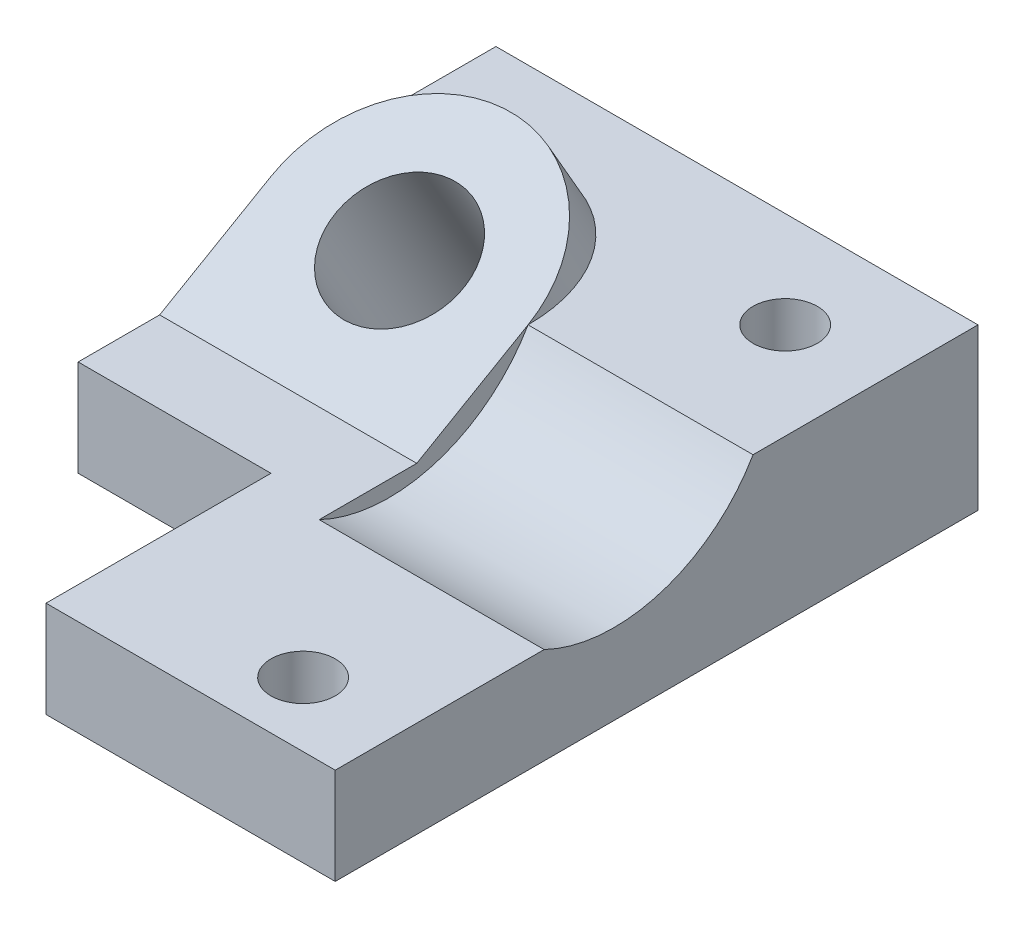
ISO-10303-21;
HEADER;
FILE_DESCRIPTION(('STEP AP214'),'2;1');
FILE_NAME('part.step','',(''),(''),'','','');
FILE_SCHEMA(('AUTOMOTIVE_DESIGN { 1 0 10303 214 1 1 1 1 }'));
ENDSEC;
DATA;
#1=APPLICATION_CONTEXT('core data for automotive mechanical design processes');
#2=APPLICATION_PROTOCOL_DEFINITION('international standard','automotive_design',2000,#1);
#3=PRODUCT_CONTEXT('',#1,'mechanical');
#4=PRODUCT('Part','Part','',(#3));
#5=PRODUCT_RELATED_PRODUCT_CATEGORY('part','',(#4));
#6=PRODUCT_DEFINITION_FORMATION('','',#4);
#7=PRODUCT_DEFINITION_CONTEXT('part definition',#1,'design');
#8=PRODUCT_DEFINITION('design','',#6,#7);
#9=PRODUCT_DEFINITION_SHAPE('','',#8);
#10=(LENGTH_UNIT() NAMED_UNIT(*) SI_UNIT(.MILLI.,.METRE.));
#11=(NAMED_UNIT(*) PLANE_ANGLE_UNIT() SI_UNIT($,.RADIAN.));
#12=(NAMED_UNIT(*) SI_UNIT($,.STERADIAN.) SOLID_ANGLE_UNIT());
#13=UNCERTAINTY_MEASURE_WITH_UNIT(LENGTH_MEASURE(1.E-05),#10,'distance_accuracy_value','');
#14=(GEOMETRIC_REPRESENTATION_CONTEXT(3) GLOBAL_UNCERTAINTY_ASSIGNED_CONTEXT((#13)) GLOBAL_UNIT_ASSIGNED_CONTEXT((#10,
#11,#12)) REPRESENTATION_CONTEXT('',''));
#15=CARTESIAN_POINT('',(0.,0.,0.));
#16=DIRECTION('',(0.,0.,1.));
#17=DIRECTION('',(1.,0.,0.));
#18=AXIS2_PLACEMENT_3D('',#15,#16,#17);
#19=CARTESIAN_POINT('',(-75.,15.,68.9739081679661));
#20=DIRECTION('',(0.,1.,0.));
#21=DIRECTION('',(0.,0.,1.));
#22=AXIS2_PLACEMENT_3D('',#19,#20,#21);
#23=PLANE('',#22);
#24=CARTESIAN_POINT('',(-15.,15.,58.9739081679661));
#25=DIRECTION('',(0.,1.,0.));
#26=DIRECTION('',(0.,0.,1.));
#27=AXIS2_PLACEMENT_3D('',#24,#25,#26);
#28=CIRCLE('',#27,5.);
#29=CARTESIAN_POINT('',(-15.,15.,63.9739081679661));
#30=VERTEX_POINT('',#29);
#31=EDGE_CURVE('E225',#30,#30,#28,.T.);
#32=ORIENTED_EDGE('',*,*,#31,.F.);
#33=EDGE_LOOP('',(#32));
#34=FACE_BOUND('',#33,.T.);
#35=DIRECTION('',(0.,0.,1.));
#36=VECTOR('',#35,1.);
#37=CARTESIAN_POINT('',(0.,15.,68.9739081679661));
#38=LINE('',#37,#36);
#39=CARTESIAN_POINT('',(0.,15.,36.4739081679661));
#40=VERTEX_POINT('',#39);
#41=CARTESIAN_POINT('',(0.,15.,68.9739081679661));
#42=VERTEX_POINT('',#41);
#43=EDGE_CURVE('E178',#40,#42,#38,.T.);
#44=ORIENTED_EDGE('',*,*,#43,.F.);
#45=DIRECTION('',(1.,0.,0.));
#46=VECTOR('',#45,1.);
#47=CARTESIAN_POINT('',(-35.,15.,36.4739081679661));
#48=LINE('',#47,#46);
#49=CARTESIAN_POINT('',(-35.,15.,36.4739081679661));
#50=VERTEX_POINT('',#49);
#51=EDGE_CURVE('E138',#50,#40,#48,.T.);
#52=ORIENTED_EDGE('',*,*,#51,.F.);
#53=DIRECTION('',(0.,0.,1.));
#54=VECTOR('',#53,1.);
#55=CARTESIAN_POINT('',(-35.,15.,0.));
#56=LINE('',#55,#54);
#57=CARTESIAN_POINT('',(-35.,15.,21.2944162436548));
#58=VERTEX_POINT('',#57);
#59=EDGE_CURVE('E128',#58,#50,#56,.T.);
#60=ORIENTED_EDGE('',*,*,#59,.F.);
#61=DIRECTION('',(-1.,0.,0.));
#62=VECTOR('',#61,1.);
#63=CARTESIAN_POINT('',(-35.,15.,21.2944162436548));
#64=LINE('',#63,#62);
#65=CARTESIAN_POINT('',(-75.,15.,21.2944162436548));
#66=VERTEX_POINT('',#65);
#67=EDGE_CURVE('E137',#58,#66,#64,.T.);
#68=ORIENTED_EDGE('',*,*,#67,.T.);
#69=DIRECTION('',(0.,0.,1.));
#70=VECTOR('',#69,1.);
#71=CARTESIAN_POINT('',(-75.,15.,68.9739081679661));
#72=LINE('',#71,#70);
#73=CARTESIAN_POINT('',(-75.,15.,33.9739081679661));
#74=VERTEX_POINT('',#73);
#75=EDGE_CURVE('E55',#66,#74,#72,.T.);
#76=ORIENTED_EDGE('',*,*,#75,.T.);
#77=DIRECTION('',(-1.,0.,0.));
#78=VECTOR('',#77,1.);
#79=CARTESIAN_POINT('',(-75.,15.,33.9739081679661));
#80=LINE('',#79,#78);
#81=CARTESIAN_POINT('',(-45.,15.,33.9739081679661));
#82=VERTEX_POINT('',#81);
#83=EDGE_CURVE('E146',#82,#74,#80,.T.);
#84=ORIENTED_EDGE('',*,*,#83,.F.);
#85=DIRECTION('',(0.,0.,-1.));
#86=VECTOR('',#85,1.);
#87=CARTESIAN_POINT('',(-45.,15.,33.9739081679661));
#88=LINE('',#87,#86);
#89=CARTESIAN_POINT('',(-45.,15.,68.9739081679661));
#90=VERTEX_POINT('',#89);
#91=EDGE_CURVE('E143',#90,#82,#88,.T.);
#92=ORIENTED_EDGE('',*,*,#91,.F.);
#93=DIRECTION('',(1.,0.,0.));
#94=VECTOR('',#93,1.);
#95=CARTESIAN_POINT('',(-75.,15.,68.9739081679661));
#96=LINE('',#95,#94);
#97=EDGE_CURVE('E183',#90,#42,#96,.T.);
#98=ORIENTED_EDGE('',*,*,#97,.T.);
#99=EDGE_LOOP('',(#44,#52,#60,#68,#76,#84,#92,#98));
#100=FACE_BOUND('',#99,.T.);
#101=ADVANCED_FACE('F39',(#34,#100),#23,.T.);
#102=CARTESIAN_POINT('',(0.,0.,0.));
#103=DIRECTION('',(-1.,0.,0.));
#104=DIRECTION('',(0.,0.,1.));
#105=AXIS2_PLACEMENT_3D('',#102,#103,#104);
#106=PLANE('',#105);
#107=CARTESIAN_POINT('',(0.,37.5180891065763,25.614089431528));
#108=DIRECTION('',(1.,0.,0.));
#109=DIRECTION('',(0.,0.,-1.));
#110=AXIS2_PLACEMENT_3D('',#107,#108,#109);
#111=CIRCLE('',#110,25.);
#112=CARTESIAN_POINT('',(0.,25.,3.97390816796609));
#113=VERTEX_POINT('',#112);
#114=EDGE_CURVE('E224',#113,#40,#111,.F.);
#115=ORIENTED_EDGE('',*,*,#114,.T.);
#116=ORIENTED_EDGE('',*,*,#43,.T.);
#117=DIRECTION('',(0.,-1.,0.));
#118=VECTOR('',#117,1.);
#119=CARTESIAN_POINT('',(0.,0.,68.9739081679661));
#120=LINE('',#119,#118);
#121=CARTESIAN_POINT('',(0.,0.,68.9739081679661));
#122=VERTEX_POINT('',#121);
#123=EDGE_CURVE('E164',#42,#122,#120,.T.);
#124=ORIENTED_EDGE('',*,*,#123,.T.);
#125=DIRECTION('',(0.,0.,-1.));
#126=VECTOR('',#125,1.);
#127=CARTESIAN_POINT('',(0.,0.,-31.0260918320339));
#128=LINE('',#127,#126);
#129=CARTESIAN_POINT('',(0.,0.,-31.0260918320339));
#130=VERTEX_POINT('',#129);
#131=EDGE_CURVE('E161',#122,#130,#128,.T.);
#132=ORIENTED_EDGE('',*,*,#131,.T.);
#133=DIRECTION('',(0.,1.,0.));
#134=VECTOR('',#133,1.);
#135=CARTESIAN_POINT('',(0.,25.,-31.0260918320339));
#136=LINE('',#135,#134);
#137=CARTESIAN_POINT('',(0.,25.,-31.0260918320339));
#138=VERTEX_POINT('',#137);
#139=EDGE_CURVE('E172',#130,#138,#136,.T.);
#140=ORIENTED_EDGE('',*,*,#139,.T.);
#141=DIRECTION('',(0.,0.,1.));
#142=VECTOR('',#141,1.);
#143=CARTESIAN_POINT('',(0.,25.,3.97390816796609));
#144=LINE('',#143,#142);
#145=EDGE_CURVE('E175',#138,#113,#144,.T.);
#146=ORIENTED_EDGE('',*,*,#145,.T.);
#147=EDGE_LOOP('',(#115,#116,#124,#132,#140,#146));
#148=FACE_BOUND('',#147,.T.);
#149=ADVANCED_FACE('F198',(#148),#106,.F.);
#150=CARTESIAN_POINT('',(-35.,25.,3.97390816796609));
#151=DIRECTION('',(0.,0.866025403784438,0.500000000000001));
#152=DIRECTION('',(0.,-0.500000000000001,0.866025403784438));
#153=AXIS2_PLACEMENT_3D('',#150,#151,#152);
#154=PLANE('',#153);
#155=CARTESIAN_POINT('',(-55.,25.,3.97390816796609));
#156=DIRECTION('',(0.,0.866025403784438,0.500000000000001));
#157=DIRECTION('',(0.,-0.500000000000001,0.866025403784438));
#158=AXIS2_PLACEMENT_3D('',#155,#156,#157);
#159=CIRCLE('',#158,10.);
#160=CARTESIAN_POINT('',(-55.,20.,12.6341622058105));
#161=VERTEX_POINT('',#160);
#162=EDGE_CURVE('E218',#161,#161,#159,.T.);
#163=ORIENTED_EDGE('',*,*,#162,.F.);
#164=EDGE_LOOP('',(#163));
#165=FACE_BOUND('',#164,.T.);
#166=ORIENTED_EDGE('',*,*,#67,.F.);
#167=DIRECTION('',(0.,0.500000000000001,-0.866025403784438));
#168=VECTOR('',#167,1.);
#169=CARTESIAN_POINT('',(-35.,20.4707527128825,11.818794589297));
#170=LINE('',#169,#168);
#171=CARTESIAN_POINT('',(-35.,25.,3.97390816796609));
#172=VERTEX_POINT('',#171);
#173=EDGE_CURVE('E125',#58,#172,#170,.T.);
#174=ORIENTED_EDGE('',*,*,#173,.T.);
#175=CARTESIAN_POINT('',(-55.,25.,3.97390816796609));
#176=DIRECTION('',(0.,0.866025403784438,0.500000000000001));
#177=DIRECTION('',(0.,0.500000000000001,-0.866025403784438));
#178=AXIS2_PLACEMENT_3D('',#175,#176,#177);
#179=CIRCLE('',#178,20.);
#180=CARTESIAN_POINT('',(-75.,25.,3.97390816796609));
#181=VERTEX_POINT('',#180);
#182=EDGE_CURVE('E214',#172,#181,#179,.T.);
#183=ORIENTED_EDGE('',*,*,#182,.T.);
#184=DIRECTION('',(0.,0.500000000000001,-0.866025403784438));
#185=VECTOR('',#184,1.);
#186=CARTESIAN_POINT('',(-75.,25.,3.97390816796609));
#187=LINE('',#186,#185);
#188=EDGE_CURVE('E142',#66,#181,#187,.T.);
#189=ORIENTED_EDGE('',*,*,#188,.F.);
#190=EDGE_LOOP('',(#166,#174,#183,#189));
#191=FACE_BOUND('',#190,.T.);
#192=ADVANCED_FACE('F141',(#165,#191),#154,.T.);
#193=CARTESIAN_POINT('',(-75.,0.,-31.0260918320339));
#194=DIRECTION('',(0.,-1.,0.));
#195=DIRECTION('',(0.,0.,-1.));
#196=AXIS2_PLACEMENT_3D('',#193,#194,#195);
#197=PLANE('',#196);
#198=CARTESIAN_POINT('',(-15.,0.,-16.0260918320339));
#199=DIRECTION('',(0.,-1.,0.));
#200=DIRECTION('',(0.,0.,-1.));
#201=AXIS2_PLACEMENT_3D('',#198,#199,#200);
#202=CIRCLE('',#201,5.);
#203=CARTESIAN_POINT('',(-15.,0.,-21.0260918320339));
#204=VERTEX_POINT('',#203);
#205=EDGE_CURVE('E230',#204,#204,#202,.T.);
#206=ORIENTED_EDGE('',*,*,#205,.F.);
#207=EDGE_LOOP('',(#206));
#208=FACE_BOUND('',#207,.T.);
#209=CARTESIAN_POINT('',(-15.,0.,58.9739081679661));
#210=DIRECTION('',(0.,-1.,0.));
#211=DIRECTION('',(0.,0.,-1.));
#212=AXIS2_PLACEMENT_3D('',#209,#210,#211);
#213=CIRCLE('',#212,5.);
#214=CARTESIAN_POINT('',(-15.,0.,53.9739081679661));
#215=VERTEX_POINT('',#214);
#216=EDGE_CURVE('E43',#215,#215,#213,.T.);
#217=ORIENTED_EDGE('',*,*,#216,.F.);
#218=EDGE_LOOP('',(#217));
#219=FACE_BOUND('',#218,.T.);
#220=CARTESIAN_POINT('',(-55.,0.,-10.4598485617746));
#221=DIRECTION('',(0.,-1.,0.));
#222=DIRECTION('',(0.,0.,1.));
#223=AXIS2_PLACEMENT_3D('',#220,#221,#222);
#224=ELLIPSE('',#223,11.5470053837925,10.);
#225=CARTESIAN_POINT('',(-55.,0.,1.08715682201792));
#226=VERTEX_POINT('',#225);
#227=EDGE_CURVE('E215',#226,#226,#224,.T.);
#228=ORIENTED_EDGE('',*,*,#227,.F.);
#229=EDGE_LOOP('',(#228));
#230=FACE_BOUND('',#229,.T.);
#231=DIRECTION('',(1.,0.,0.));
#232=VECTOR('',#231,1.);
#233=CARTESIAN_POINT('',(-75.,0.,33.9739081679661));
#234=LINE('',#233,#232);
#235=CARTESIAN_POINT('',(-75.,0.,33.9739081679661));
#236=VERTEX_POINT('',#235);
#237=CARTESIAN_POINT('',(-45.,0.,33.9739081679661));
#238=VERTEX_POINT('',#237);
#239=EDGE_CURVE('E156',#236,#238,#234,.T.);
#240=ORIENTED_EDGE('',*,*,#239,.F.);
#241=DIRECTION('',(0.,0.,-1.));
#242=VECTOR('',#241,1.);
#243=CARTESIAN_POINT('',(-75.,0.,-31.0260918320339));
#244=LINE('',#243,#242);
#245=CARTESIAN_POINT('',(-75.,0.,-31.0260918320339));
#246=VERTEX_POINT('',#245);
#247=EDGE_CURVE('E90',#236,#246,#244,.T.);
#248=ORIENTED_EDGE('',*,*,#247,.T.);
#249=DIRECTION('',(1.,0.,0.));
#250=VECTOR('',#249,1.);
#251=CARTESIAN_POINT('',(-75.,0.,-31.0260918320339));
#252=LINE('',#251,#250);
#253=EDGE_CURVE('E169',#246,#130,#252,.T.);
#254=ORIENTED_EDGE('',*,*,#253,.T.);
#255=ORIENTED_EDGE('',*,*,#131,.F.);
#256=DIRECTION('',(1.,0.,0.));
#257=VECTOR('',#256,1.);
#258=CARTESIAN_POINT('',(-75.,0.,68.9739081679661));
#259=LINE('',#258,#257);
#260=CARTESIAN_POINT('',(-45.,0.,68.9739081679661));
#261=VERTEX_POINT('',#260);
#262=EDGE_CURVE('E48',#261,#122,#259,.T.);
#263=ORIENTED_EDGE('',*,*,#262,.F.);
#264=DIRECTION('',(0.,0.,1.));
#265=VECTOR('',#264,1.);
#266=CARTESIAN_POINT('',(-45.,0.,-31.0260918320339));
#267=LINE('',#266,#265);
#268=EDGE_CURVE('E159',#238,#261,#267,.T.);
#269=ORIENTED_EDGE('',*,*,#268,.F.);
#270=EDGE_LOOP('',(#240,#248,#254,#255,#263,#269));
#271=FACE_BOUND('',#270,.T.);
#272=ADVANCED_FACE('F41',(#208,#219,#230,#271),#197,.T.);
#273=CARTESIAN_POINT('',(-75.,0.,68.9739081679661));
#274=DIRECTION('',(0.,0.,1.));
#275=DIRECTION('',(1.,0.,0.));
#276=AXIS2_PLACEMENT_3D('',#273,#274,#275);
#277=PLANE('',#276);
#278=DIRECTION('',(0.,1.,0.));
#279=VECTOR('',#278,1.);
#280=CARTESIAN_POINT('',(-45.,-60.,68.9739081679661));
#281=LINE('',#280,#279);
#282=EDGE_CURVE('E153',#261,#90,#281,.T.);
#283=ORIENTED_EDGE('',*,*,#282,.F.);
#284=ORIENTED_EDGE('',*,*,#262,.T.);
#285=ORIENTED_EDGE('',*,*,#123,.F.);
#286=ORIENTED_EDGE('',*,*,#97,.F.);
#287=EDGE_LOOP('',(#283,#284,#285,#286));
#288=FACE_BOUND('',#287,.T.);
#289=ADVANCED_FACE('F200',(#288),#277,.T.);
#290=CARTESIAN_POINT('',(-75.,25.,3.97390816796609));
#291=DIRECTION('',(0.,1.,0.));
#292=DIRECTION('',(0.,0.,1.));
#293=AXIS2_PLACEMENT_3D('',#290,#291,#292);
#294=PLANE('',#293);
#295=CARTESIAN_POINT('',(-15.,25.,-16.0260918320339));
#296=DIRECTION('',(0.,1.,0.));
#297=DIRECTION('',(0.,0.,1.));
#298=AXIS2_PLACEMENT_3D('',#295,#296,#297);
#299=CIRCLE('',#298,5.);
#300=CARTESIAN_POINT('',(-15.,25.,-11.0260918320339));
#301=VERTEX_POINT('',#300);
#302=EDGE_CURVE('E233',#301,#301,#299,.T.);
#303=ORIENTED_EDGE('',*,*,#302,.F.);
#304=EDGE_LOOP('',(#303));
#305=FACE_BOUND('',#304,.T.);
#306=CARTESIAN_POINT('',(-55.,25.,3.97390816796609));
#307=DIRECTION('',(0.,1.,0.));
#308=DIRECTION('',(0.,0.,1.));
#309=AXIS2_PLACEMENT_3D('',#306,#307,#308);
#310=ELLIPSE('',#309,23.0940107675851,20.);
#311=EDGE_CURVE('E148',#172,#181,#310,.T.);
#312=ORIENTED_EDGE('',*,*,#311,.F.);
#313=DIRECTION('',(1.,0.,0.));
#314=VECTOR('',#313,1.);
#315=CARTESIAN_POINT('',(-75.,25.,3.97390816796609));
#316=LINE('',#315,#314);
#317=EDGE_CURVE('E186',#172,#113,#316,.T.);
#318=ORIENTED_EDGE('',*,*,#317,.T.);
#319=ORIENTED_EDGE('',*,*,#145,.F.);
#320=DIRECTION('',(1.,0.,0.));
#321=VECTOR('',#320,1.);
#322=CARTESIAN_POINT('',(-75.,25.,-31.0260918320339));
#323=LINE('',#322,#321);
#324=CARTESIAN_POINT('',(-75.,25.,-31.0260918320339));
#325=VERTEX_POINT('',#324);
#326=EDGE_CURVE('E189',#325,#138,#323,.T.);
#327=ORIENTED_EDGE('',*,*,#326,.F.);
#328=DIRECTION('',(0.,0.,1.));
#329=VECTOR('',#328,1.);
#330=CARTESIAN_POINT('',(-75.,25.,3.97390816796609));
#331=LINE('',#330,#329);
#332=EDGE_CURVE('E64',#325,#181,#331,.T.);
#333=ORIENTED_EDGE('',*,*,#332,.T.);
#334=EDGE_LOOP('',(#312,#318,#319,#327,#333));
#335=FACE_BOUND('',#334,.T.);
#336=ADVANCED_FACE('F239',(#305,#335),#294,.T.);
#337=CARTESIAN_POINT('',(-75.,25.,-31.0260918320339));
#338=DIRECTION('',(0.,0.,-1.));
#339=DIRECTION('',(0.,1.,0.));
#340=AXIS2_PLACEMENT_3D('',#337,#338,#339);
#341=PLANE('',#340);
#342=ORIENTED_EDGE('',*,*,#139,.F.);
#343=ORIENTED_EDGE('',*,*,#253,.F.);
#344=DIRECTION('',(0.,1.,0.));
#345=VECTOR('',#344,1.);
#346=CARTESIAN_POINT('',(-75.,25.,-31.0260918320339));
#347=LINE('',#346,#345);
#348=EDGE_CURVE('E163',#246,#325,#347,.T.);
#349=ORIENTED_EDGE('',*,*,#348,.T.);
#350=ORIENTED_EDGE('',*,*,#326,.T.);
#351=EDGE_LOOP('',(#342,#343,#349,#350));
#352=FACE_BOUND('',#351,.T.);
#353=ADVANCED_FACE('F194',(#352),#341,.T.);
#354=CARTESIAN_POINT('',(-75.,0.,0.));
#355=DIRECTION('',(-1.,0.,0.));
#356=DIRECTION('',(0.,0.,1.));
#357=AXIS2_PLACEMENT_3D('',#354,#355,#356);
#358=PLANE('',#357);
#359=ORIENTED_EDGE('',*,*,#188,.T.);
#360=ORIENTED_EDGE('',*,*,#332,.F.);
#361=ORIENTED_EDGE('',*,*,#348,.F.);
#362=ORIENTED_EDGE('',*,*,#247,.F.);
#363=DIRECTION('',(0.,-1.,0.));
#364=VECTOR('',#363,1.);
#365=CARTESIAN_POINT('',(-75.,0.,33.9739081679661));
#366=LINE('',#365,#364);
#367=EDGE_CURVE('E11',#74,#236,#366,.T.);
#368=ORIENTED_EDGE('',*,*,#367,.F.);
#369=ORIENTED_EDGE('',*,*,#75,.F.);
#370=EDGE_LOOP('',(#359,#360,#361,#362,#368,#369));
#371=FACE_BOUND('',#370,.T.);
#372=ADVANCED_FACE('F209',(#371),#358,.T.);
#373=CARTESIAN_POINT('',(-75.,-60.,33.9739081679661));
#374=DIRECTION('',(0.,0.,-1.));
#375=DIRECTION('',(-1.,0.,0.));
#376=AXIS2_PLACEMENT_3D('',#373,#374,#375);
#377=PLANE('',#376);
#378=ORIENTED_EDGE('',*,*,#239,.T.);
#379=DIRECTION('',(0.,1.,0.));
#380=VECTOR('',#379,1.);
#381=CARTESIAN_POINT('',(-45.,-60.,33.9739081679661));
#382=LINE('',#381,#380);
#383=EDGE_CURVE('E154',#238,#82,#382,.T.);
#384=ORIENTED_EDGE('',*,*,#383,.T.);
#385=ORIENTED_EDGE('',*,*,#83,.T.);
#386=ORIENTED_EDGE('',*,*,#367,.T.);
#387=EDGE_LOOP('',(#378,#384,#385,#386));
#388=FACE_BOUND('',#387,.T.);
#389=ADVANCED_FACE('F258',(#388),#377,.F.);
#390=CARTESIAN_POINT('',(-45.,-60.,33.9739081679661));
#391=DIRECTION('',(1.,0.,0.));
#392=DIRECTION('',(0.,0.,-1.));
#393=AXIS2_PLACEMENT_3D('',#390,#391,#392);
#394=PLANE('',#393);
#395=ORIENTED_EDGE('',*,*,#268,.T.);
#396=ORIENTED_EDGE('',*,*,#282,.T.);
#397=ORIENTED_EDGE('',*,*,#91,.T.);
#398=ORIENTED_EDGE('',*,*,#383,.F.);
#399=EDGE_LOOP('',(#395,#396,#397,#398));
#400=FACE_BOUND('',#399,.T.);
#401=ADVANCED_FACE('F204',(#400),#394,.F.);
#402=CARTESIAN_POINT('',(-55.,2.48333950160464,-9.02609183203393));
#403=DIRECTION('',(0.,0.866025403784438,0.500000000000001));
#404=DIRECTION('',(0.,-0.500000000000001,0.866025403784438));
#405=AXIS2_PLACEMENT_3D('',#402,#403,#404);
#406=CYLINDRICAL_SURFACE('',#405,20.);
#407=ORIENTED_EDGE('',*,*,#182,.F.);
#408=ORIENTED_EDGE('',*,*,#311,.T.);
#409=EDGE_LOOP('',(#407,#408));
#410=FACE_BOUND('',#409,.T.);
#411=ADVANCED_FACE('F213',(#410),#406,.T.);
#412=CARTESIAN_POINT('',(-55.,-8.90544456622768,-15.6014093793395));
#413=DIRECTION('',(0.,0.866025403784438,0.500000000000001));
#414=DIRECTION('',(0.,-0.500000000000001,0.866025403784438));
#415=AXIS2_PLACEMENT_3D('',#412,#413,#414);
#416=CYLINDRICAL_SURFACE('',#415,10.);
#417=ORIENTED_EDGE('',*,*,#227,.T.);
#418=EDGE_LOOP('',(#417));
#419=FACE_BOUND('',#418,.T.);
#420=ORIENTED_EDGE('',*,*,#162,.T.);
#421=EDGE_LOOP('',(#420));
#422=FACE_BOUND('',#421,.T.);
#423=ADVANCED_FACE('F268',(#419,#422),#416,.F.);
#424=CARTESIAN_POINT('',(-35.,37.5180891065763,25.614089431528));
#425=DIRECTION('',(1.,0.,0.));
#426=DIRECTION('',(0.,0.,-1.));
#427=AXIS2_PLACEMENT_3D('',#424,#425,#426);
#428=CYLINDRICAL_SURFACE('',#427,25.);
#429=ORIENTED_EDGE('',*,*,#114,.F.);
#430=ORIENTED_EDGE('',*,*,#317,.F.);
#431=CARTESIAN_POINT('',(-35.,37.5180891065763,25.614089431528));
#432=DIRECTION('',(1.,0.,0.));
#433=DIRECTION('',(0.,0.,-1.));
#434=AXIS2_PLACEMENT_3D('',#431,#432,#433);
#435=CIRCLE('',#434,25.);
#436=EDGE_CURVE('E130',#172,#50,#435,.F.);
#437=ORIENTED_EDGE('',*,*,#436,.T.);
#438=ORIENTED_EDGE('',*,*,#51,.T.);
#439=EDGE_LOOP('',(#429,#430,#437,#438));
#440=FACE_BOUND('',#439,.T.);
#441=ADVANCED_FACE('F271',(#440),#428,.F.);
#442=CARTESIAN_POINT('',(-35.,0.,0.));
#443=DIRECTION('',(1.,0.,0.));
#444=DIRECTION('',(0.,0.,-1.));
#445=AXIS2_PLACEMENT_3D('',#442,#443,#444);
#446=PLANE('',#445);
#447=ORIENTED_EDGE('',*,*,#436,.F.);
#448=ORIENTED_EDGE('',*,*,#173,.F.);
#449=ORIENTED_EDGE('',*,*,#59,.T.);
#450=EDGE_LOOP('',(#447,#448,#449));
#451=FACE_BOUND('',#450,.T.);
#452=ADVANCED_FACE('F127',(#451),#446,.T.);
#453=CARTESIAN_POINT('',(-15.,-9.99999999999997,-16.0260918320339));
#454=DIRECTION('',(0.,1.,0.));
#455=DIRECTION('',(0.,0.,1.));
#456=AXIS2_PLACEMENT_3D('',#453,#454,#455);
#457=CYLINDRICAL_SURFACE('',#456,5.);
#458=ORIENTED_EDGE('',*,*,#205,.T.);
#459=EDGE_LOOP('',(#458));
#460=FACE_BOUND('',#459,.T.);
#461=ORIENTED_EDGE('',*,*,#302,.T.);
#462=EDGE_LOOP('',(#461));
#463=FACE_BOUND('',#462,.T.);
#464=ADVANCED_FACE('F237',(#460,#463),#457,.F.);
#465=CARTESIAN_POINT('',(-15.,-9.99999999999997,58.9739081679661));
#466=DIRECTION('',(0.,1.,0.));
#467=DIRECTION('',(0.,0.,1.));
#468=AXIS2_PLACEMENT_3D('',#465,#466,#467);
#469=CYLINDRICAL_SURFACE('',#468,5.);
#470=ORIENTED_EDGE('',*,*,#31,.T.);
#471=EDGE_LOOP('',(#470));
#472=FACE_BOUND('',#471,.T.);
#473=ORIENTED_EDGE('',*,*,#216,.T.);
#474=EDGE_LOOP('',(#473));
#475=FACE_BOUND('',#474,.T.);
#476=ADVANCED_FACE('F278',(#472,#475),#469,.F.);
#477=CLOSED_SHELL('',(#101,#149,#192,#272,#289,#336,#353,#372,#389,#401,#411,#423,#441,#452,
#464,#476));
#478=MANIFOLD_SOLID_BREP('B2',#477);
#479=ADVANCED_BREP_SHAPE_REPRESENTATION('',(#18,#478),#14);
#480=SHAPE_DEFINITION_REPRESENTATION(#9,#479);
ENDSEC;
END-ISO-10303-21;
